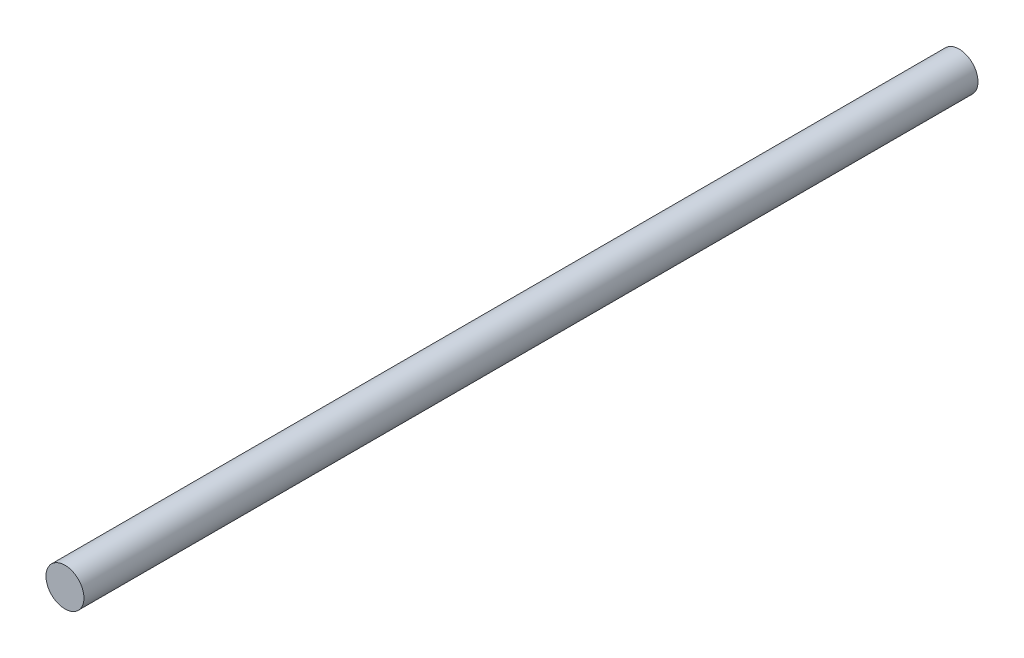
ISO-10303-21;
HEADER;
FILE_DESCRIPTION(('STEP AP214'),'2;1');
FILE_NAME('part.step','',(''),(''),'','','');
FILE_SCHEMA(('AUTOMOTIVE_DESIGN { 1 0 10303 214 1 1 1 1 }'));
ENDSEC;
DATA;
#1=APPLICATION_CONTEXT('core data for automotive mechanical design processes');
#2=APPLICATION_PROTOCOL_DEFINITION('international standard','automotive_design',2000,#1);
#3=PRODUCT_CONTEXT('',#1,'mechanical');
#4=PRODUCT('Part','Part','',(#3));
#5=PRODUCT_RELATED_PRODUCT_CATEGORY('part','',(#4));
#6=PRODUCT_DEFINITION_FORMATION('','',#4);
#7=PRODUCT_DEFINITION_CONTEXT('part definition',#1,'design');
#8=PRODUCT_DEFINITION('design','',#6,#7);
#9=PRODUCT_DEFINITION_SHAPE('','',#8);
#10=(LENGTH_UNIT() NAMED_UNIT(*) SI_UNIT(.MILLI.,.METRE.));
#11=(NAMED_UNIT(*) PLANE_ANGLE_UNIT() SI_UNIT($,.RADIAN.));
#12=(NAMED_UNIT(*) SI_UNIT($,.STERADIAN.) SOLID_ANGLE_UNIT());
#13=UNCERTAINTY_MEASURE_WITH_UNIT(LENGTH_MEASURE(1.E-05),#10,'distance_accuracy_value','');
#14=(GEOMETRIC_REPRESENTATION_CONTEXT(3) GLOBAL_UNCERTAINTY_ASSIGNED_CONTEXT((#13)) GLOBAL_UNIT_ASSIGNED_CONTEXT((#10,
#11,#12)) REPRESENTATION_CONTEXT('',''));
#15=CARTESIAN_POINT('',(0.,0.,0.));
#16=DIRECTION('',(0.,0.,1.));
#17=DIRECTION('',(1.,0.,0.));
#18=AXIS2_PLACEMENT_3D('',#15,#16,#17);
#19=CARTESIAN_POINT('',(41.2990441408368,58.9121290826703,-58.9));
#20=DIRECTION('',(0.,0.,1.));
#21=DIRECTION('',(-0.296144445076758,-0.955143166049037,0.));
#22=AXIS2_PLACEMENT_3D('',#19,#20,#21);
#23=PLANE('',#22);
#24=CARTESIAN_POINT('',(0.,0.,-58.9));
#25=DIRECTION('',(0.,0.,1.));
#26=DIRECTION('',(1.,0.,0.));
#27=AXIS2_PLACEMENT_3D('',#24,#25,#26);
#28=CIRCLE('',#27,1.25);
#29=CARTESIAN_POINT('',(1.25,0.,-58.9));
#30=VERTEX_POINT('',#29);
#31=EDGE_CURVE('E10',#30,#30,#28,.F.);
#32=ORIENTED_EDGE('',*,*,#31,.T.);
#33=EDGE_LOOP('',(#32));
#34=FACE_BOUND('',#33,.T.);
#35=ADVANCED_FACE('F37',(#34),#23,.F.);
#36=CARTESIAN_POINT('',(0.,0.,0.));
#37=DIRECTION('',(0.,0.,1.));
#38=DIRECTION('',(1.,0.,0.));
#39=AXIS2_PLACEMENT_3D('',#36,#37,#38);
#40=PLANE('',#39);
#41=CARTESIAN_POINT('',(0.,0.,0.));
#42=DIRECTION('',(0.,0.,1.));
#43=DIRECTION('',(1.,0.,0.));
#44=AXIS2_PLACEMENT_3D('',#41,#42,#43);
#45=CIRCLE('',#44,1.25);
#46=CARTESIAN_POINT('',(1.25,0.,0.));
#47=VERTEX_POINT('',#46);
#48=EDGE_CURVE('E43',#47,#47,#45,.T.);
#49=ORIENTED_EDGE('',*,*,#48,.T.);
#50=EDGE_LOOP('',(#49));
#51=FACE_BOUND('',#50,.T.);
#52=ADVANCED_FACE('F49',(#51),#40,.T.);
#53=CARTESIAN_POINT('',(0.,0.,-128.902));
#54=DIRECTION('',(0.,0.,1.));
#55=DIRECTION('',(1.,0.,0.));
#56=AXIS2_PLACEMENT_3D('',#53,#54,#55);
#57=CYLINDRICAL_SURFACE('',#56,1.25);
#58=ORIENTED_EDGE('',*,*,#31,.F.);
#59=EDGE_LOOP('',(#58));
#60=FACE_BOUND('',#59,.T.);
#61=ORIENTED_EDGE('',*,*,#48,.F.);
#62=EDGE_LOOP('',(#61));
#63=FACE_BOUND('',#62,.T.);
#64=ADVANCED_FACE('F51',(#60,#63),#57,.T.);
#65=CLOSED_SHELL('',(#35,#52,#64));
#66=MANIFOLD_SOLID_BREP('B2',#65);
#67=ADVANCED_BREP_SHAPE_REPRESENTATION('',(#18,#66),#14);
#68=SHAPE_DEFINITION_REPRESENTATION(#9,#67);
ENDSEC;
END-ISO-10303-21;
